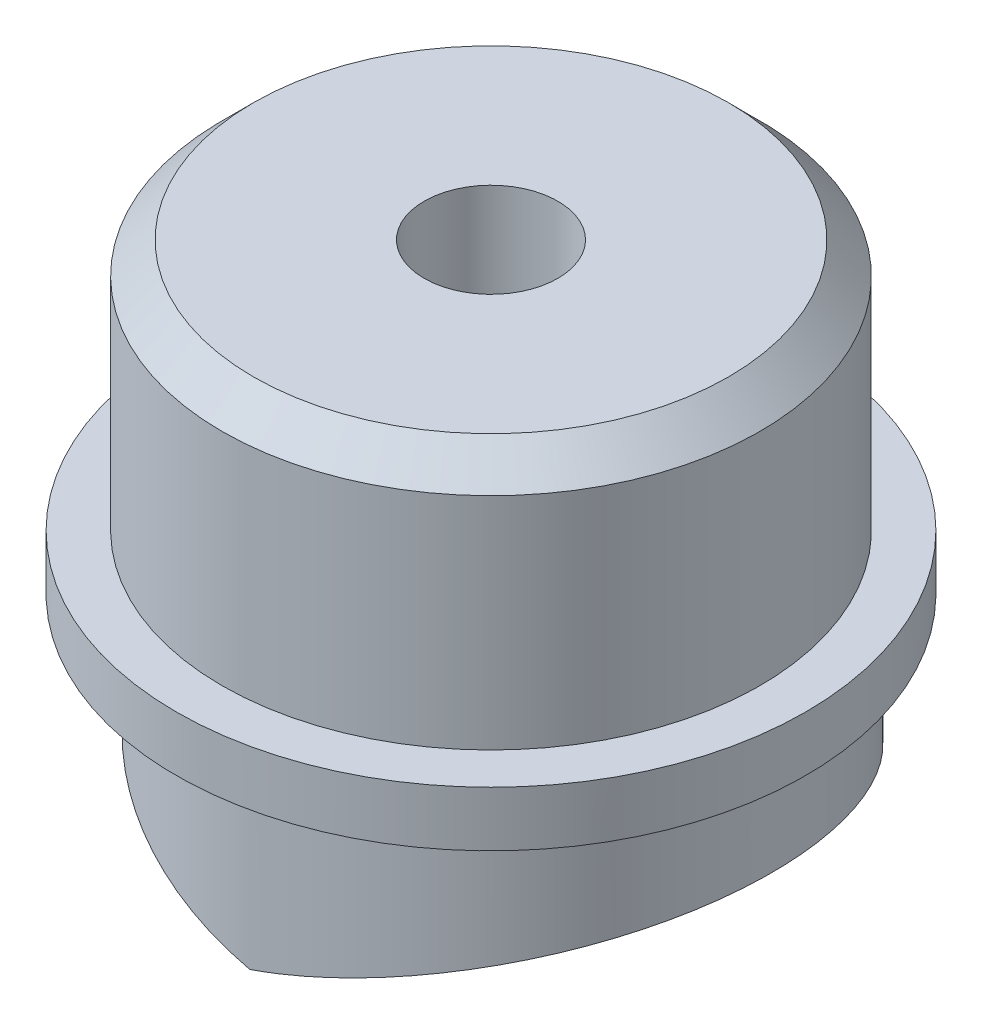
ISO-10303-21;
HEADER;
FILE_DESCRIPTION(('STEP AP214'),'2;1');
FILE_NAME('part.step','',(''),(''),'','','');
FILE_SCHEMA(('AUTOMOTIVE_DESIGN { 1 0 10303 214 1 1 1 1 }'));
ENDSEC;
DATA;
#1=APPLICATION_CONTEXT('core data for automotive mechanical design processes');
#2=APPLICATION_PROTOCOL_DEFINITION('international standard','automotive_design',2000,#1);
#3=PRODUCT_CONTEXT('',#1,'mechanical');
#4=PRODUCT('Part','Part','',(#3));
#5=PRODUCT_RELATED_PRODUCT_CATEGORY('part','',(#4));
#6=PRODUCT_DEFINITION_FORMATION('','',#4);
#7=PRODUCT_DEFINITION_CONTEXT('part definition',#1,'design');
#8=PRODUCT_DEFINITION('design','',#6,#7);
#9=PRODUCT_DEFINITION_SHAPE('','',#8);
#10=(LENGTH_UNIT() NAMED_UNIT(*) SI_UNIT(.MILLI.,.METRE.));
#11=(NAMED_UNIT(*) PLANE_ANGLE_UNIT() SI_UNIT($,.RADIAN.));
#12=(NAMED_UNIT(*) SI_UNIT($,.STERADIAN.) SOLID_ANGLE_UNIT());
#13=UNCERTAINTY_MEASURE_WITH_UNIT(LENGTH_MEASURE(1.E-05),#10,'distance_accuracy_value','');
#14=(GEOMETRIC_REPRESENTATION_CONTEXT(3) GLOBAL_UNCERTAINTY_ASSIGNED_CONTEXT((#13)) GLOBAL_UNIT_ASSIGNED_CONTEXT((#10,
#11,#12)) REPRESENTATION_CONTEXT('',''));
#15=CARTESIAN_POINT('',(0.,0.,0.));
#16=DIRECTION('',(0.,0.,1.));
#17=DIRECTION('',(1.,0.,0.));
#18=AXIS2_PLACEMENT_3D('',#15,#16,#17);
#19=CARTESIAN_POINT('',(-10.,25.4999999999969,-14.01));
#20=DIRECTION('',(-0.287347885566345,-0.957826285221151,0.));
#21=DIRECTION('',(0.957826285221151,-0.287347885566345,0.));
#22=AXIS2_PLACEMENT_3D('',#19,#20,#21);
#23=PLANE('',#22);
#24=DIRECTION('',(0.,0.,1.));
#25=VECTOR('',#24,1.);
#26=CARTESIAN_POINT('',(0.,22.4999999999969,-14.01));
#27=LINE('',#26,#25);
#28=CARTESIAN_POINT('',(0.,22.4999999999969,7.09999999999999));
#29=VERTEX_POINT('',#28);
#30=CARTESIAN_POINT('',(0.,22.4999999999969,7.66934219228311));
#31=VERTEX_POINT('',#30);
#32=EDGE_CURVE('E11',#29,#31,#27,.T.);
#33=ORIENTED_EDGE('',*,*,#32,.T.);
#34=CARTESIAN_POINT('',(-0.500000000000004,22.6499999999969,-0.866025403784436));
#35=DIRECTION('',(-0.287347885566345,-0.957826285221151,0.));
#36=DIRECTION('',(0.957826285221151,-0.287347885566345,0.));
#37=AXIS2_PLACEMENT_3D('',#34,#35,#36);
#38=ELLIPSE('',#37,8.92646206511852,8.55);
#39=CARTESIAN_POINT('',(0.,22.4999999999969,-9.40139299985199));
#40=VERTEX_POINT('',#39);
#41=EDGE_CURVE('E87',#31,#40,#38,.T.);
#42=ORIENTED_EDGE('',*,*,#41,.T.);
#43=CARTESIAN_POINT('',(0.,22.4999999999969,-2.125));
#44=VERTEX_POINT('',#43);
#45=EDGE_CURVE('E54',#40,#44,#27,.T.);
#46=ORIENTED_EDGE('',*,*,#45,.T.);
#47=CARTESIAN_POINT('',(0.,22.4999999999969,0.));
#48=DIRECTION('',(-0.287347885566345,-0.957826285221151,0.));
#49=DIRECTION('',(0.957826285221151,-0.287347885566345,0.));
#50=AXIS2_PLACEMENT_3D('',#47,#48,#49);
#51=ELLIPSE('',#50,2.21856513314349,2.125);
#52=CARTESIAN_POINT('',(0.,22.4999999999969,2.125));
#53=VERTEX_POINT('',#52);
#54=EDGE_CURVE('E47',#44,#53,#51,.F.);
#55=ORIENTED_EDGE('',*,*,#54,.T.);
#56=CARTESIAN_POINT('',(0.,22.4999999999969,2.89999999999999));
#57=VERTEX_POINT('',#56);
#58=EDGE_CURVE('E52',#53,#57,#27,.T.);
#59=ORIENTED_EDGE('',*,*,#58,.T.);
#60=CARTESIAN_POINT('',(0.,22.4999999999969,5.));
#61=DIRECTION('',(-0.287347885566345,-0.957826285221151,0.));
#62=DIRECTION('',(0.957826285221151,-0.287347885566345,0.));
#63=AXIS2_PLACEMENT_3D('',#60,#61,#62);
#64=ELLIPSE('',#63,2.19246436687122,2.1);
#65=EDGE_CURVE('E158',#29,#57,#64,.T.);
#66=ORIENTED_EDGE('',*,*,#65,.F.);
#67=EDGE_LOOP('',(#33,#42,#46,#55,#59,#66));
#68=FACE_BOUND('',#67,.T.);
#69=CARTESIAN_POINT('',(-4.33012701892218,23.7990381056736,-2.50000000000002));
#70=DIRECTION('',(-0.287347885566345,-0.957826285221151,0.));
#71=DIRECTION('',(0.957826285221151,-0.287347885566345,0.));
#72=AXIS2_PLACEMENT_3D('',#69,#70,#71);
#73=ELLIPSE('',#72,2.19246436687122,2.1);
#74=CARTESIAN_POINT('',(-2.23012701892218,23.1690381056736,-2.50000000000002));
#75=VERTEX_POINT('',#74);
#76=EDGE_CURVE('E95',#75,#75,#73,.T.);
#77=ORIENTED_EDGE('',*,*,#76,.F.);
#78=EDGE_LOOP('',(#77));
#79=FACE_BOUND('',#78,.T.);
#80=ADVANCED_FACE('F43',(#68,#79),#23,.T.);
#81=CARTESIAN_POINT('',(10.,25.4999999999969,-14.01));
#82=DIRECTION('',(0.287347885566345,-0.957826285221151,0.));
#83=DIRECTION('',(0.957826285221151,0.287347885566345,0.));
#84=AXIS2_PLACEMENT_3D('',#81,#82,#83);
#85=PLANE('',#84);
#86=ORIENTED_EDGE('',*,*,#45,.F.);
#87=CARTESIAN_POINT('',(-0.500000000000004,22.3499999999969,-0.866025403784436));
#88=DIRECTION('',(0.287347885566345,-0.957826285221151,0.));
#89=DIRECTION('',(-0.957826285221151,-0.287347885566345,0.));
#90=AXIS2_PLACEMENT_3D('',#87,#88,#89);
#91=ELLIPSE('',#90,8.92646206511852,8.55);
#92=EDGE_CURVE('E81',#40,#31,#91,.T.);
#93=ORIENTED_EDGE('',*,*,#92,.T.);
#94=ORIENTED_EDGE('',*,*,#32,.F.);
#95=CARTESIAN_POINT('',(0.,22.4999999999969,5.));
#96=DIRECTION('',(0.287347885566345,-0.957826285221151,0.));
#97=DIRECTION('',(-0.957826285221151,-0.287347885566345,0.));
#98=AXIS2_PLACEMENT_3D('',#95,#96,#97);
#99=ELLIPSE('',#98,2.19246436687122,2.1);
#100=EDGE_CURVE('E161',#57,#29,#99,.T.);
#101=ORIENTED_EDGE('',*,*,#100,.F.);
#102=ORIENTED_EDGE('',*,*,#58,.F.);
#103=CARTESIAN_POINT('',(0.,22.4999999999969,0.));
#104=DIRECTION('',(0.287347885566345,-0.957826285221151,0.));
#105=DIRECTION('',(-0.957826285221151,-0.287347885566345,0.));
#106=AXIS2_PLACEMENT_3D('',#103,#104,#105);
#107=ELLIPSE('',#106,2.21856513314349,2.125);
#108=EDGE_CURVE('E83',#53,#44,#107,.F.);
#109=ORIENTED_EDGE('',*,*,#108,.T.);
#110=EDGE_LOOP('',(#86,#93,#94,#101,#102,#109));
#111=FACE_BOUND('',#110,.T.);
#112=CARTESIAN_POINT('',(4.33012701892218,23.7990381056736,-2.50000000000002));
#113=DIRECTION('',(0.287347885566345,-0.957826285221151,0.));
#114=DIRECTION('',(-0.957826285221151,-0.287347885566345,0.));
#115=AXIS2_PLACEMENT_3D('',#112,#113,#114);
#116=ELLIPSE('',#115,2.19246436687122,2.1);
#117=CARTESIAN_POINT('',(2.23012701892218,23.1690381056736,-2.50000000000002));
#118=VERTEX_POINT('',#117);
#119=EDGE_CURVE('E92',#118,#118,#116,.T.);
#120=ORIENTED_EDGE('',*,*,#119,.F.);
#121=EDGE_LOOP('',(#120));
#122=FACE_BOUND('',#121,.T.);
#123=ADVANCED_FACE('F78',(#111,#122),#85,.T.);
#124=CARTESIAN_POINT('',(0.,31.5,5.));
#125=DIRECTION('',(0.,-1.,0.));
#126=DIRECTION('',(0.,0.,-1.));
#127=AXIS2_PLACEMENT_3D('',#124,#125,#126);
#128=CYLINDRICAL_SURFACE('',#127,2.1);
#129=CARTESIAN_POINT('',(0.,31.5,5.));
#130=DIRECTION('',(0.,1.,0.));
#131=DIRECTION('',(0.,0.,1.));
#132=AXIS2_PLACEMENT_3D('',#129,#130,#131);
#133=CIRCLE('',#132,2.1);
#134=CARTESIAN_POINT('',(0.,31.5,7.1));
#135=VERTEX_POINT('',#134);
#136=EDGE_CURVE('E85',#135,#135,#133,.T.);
#137=ORIENTED_EDGE('',*,*,#136,.T.);
#138=EDGE_LOOP('',(#137));
#139=FACE_BOUND('',#138,.T.);
#140=ORIENTED_EDGE('',*,*,#65,.T.);
#141=ORIENTED_EDGE('',*,*,#100,.T.);
#142=EDGE_LOOP('',(#140,#141));
#143=FACE_BOUND('',#142,.T.);
#144=ADVANCED_FACE('F110',(#139,#143),#128,.F.);
#145=CARTESIAN_POINT('',(0.,31.5,5.));
#146=DIRECTION('',(0.,1.,0.));
#147=DIRECTION('',(0.,0.,1.));
#148=AXIS2_PLACEMENT_3D('',#145,#146,#147);
#149=PLANE('',#148);
#150=ORIENTED_EDGE('',*,*,#136,.F.);
#151=EDGE_LOOP('',(#150));
#152=FACE_BOUND('',#151,.T.);
#153=ADVANCED_FACE('F125',(#152),#149,.F.);
#154=CARTESIAN_POINT('',(-4.33012701892218,31.5,-2.50000000000002));
#155=DIRECTION('',(0.,-1.,0.));
#156=DIRECTION('',(0.,0.,-1.));
#157=AXIS2_PLACEMENT_3D('',#154,#155,#156);
#158=CYLINDRICAL_SURFACE('',#157,2.1);
#159=CARTESIAN_POINT('',(-4.33012701892218,31.5,-2.50000000000002));
#160=DIRECTION('',(0.,1.,0.));
#161=DIRECTION('',(0.,0.,1.));
#162=AXIS2_PLACEMENT_3D('',#159,#160,#161);
#163=CIRCLE('',#162,2.1);
#164=CARTESIAN_POINT('',(-4.33012701892218,31.5,-0.400000000000019));
#165=VERTEX_POINT('',#164);
#166=EDGE_CURVE('E148',#165,#165,#163,.T.);
#167=ORIENTED_EDGE('',*,*,#166,.T.);
#168=EDGE_LOOP('',(#167));
#169=FACE_BOUND('',#168,.T.);
#170=ORIENTED_EDGE('',*,*,#76,.T.);
#171=EDGE_LOOP('',(#170));
#172=FACE_BOUND('',#171,.T.);
#173=ADVANCED_FACE('F127',(#169,#172),#158,.F.);
#174=CARTESIAN_POINT('',(-4.33012701892218,31.5,-2.50000000000002));
#175=DIRECTION('',(0.,1.,0.));
#176=DIRECTION('',(0.,0.,1.));
#177=AXIS2_PLACEMENT_3D('',#174,#175,#176);
#178=PLANE('',#177);
#179=ORIENTED_EDGE('',*,*,#166,.F.);
#180=EDGE_LOOP('',(#179));
#181=FACE_BOUND('',#180,.T.);
#182=ADVANCED_FACE('F129',(#181),#178,.F.);
#183=CARTESIAN_POINT('',(4.33012701892218,31.5,-2.50000000000002));
#184=DIRECTION('',(0.,-1.,0.));
#185=DIRECTION('',(0.,0.,-1.));
#186=AXIS2_PLACEMENT_3D('',#183,#184,#185);
#187=CYLINDRICAL_SURFACE('',#186,2.1);
#188=CARTESIAN_POINT('',(4.33012701892218,31.5,-2.50000000000002));
#189=DIRECTION('',(0.,1.,0.));
#190=DIRECTION('',(0.,0.,1.));
#191=AXIS2_PLACEMENT_3D('',#188,#189,#190);
#192=CIRCLE('',#191,2.1);
#193=CARTESIAN_POINT('',(4.33012701892218,31.5,-0.400000000000021));
#194=VERTEX_POINT('',#193);
#195=EDGE_CURVE('E146',#194,#194,#192,.T.);
#196=ORIENTED_EDGE('',*,*,#195,.T.);
#197=EDGE_LOOP('',(#196));
#198=FACE_BOUND('',#197,.T.);
#199=ORIENTED_EDGE('',*,*,#119,.T.);
#200=EDGE_LOOP('',(#199));
#201=FACE_BOUND('',#200,.T.);
#202=ADVANCED_FACE('F131',(#198,#201),#187,.F.);
#203=CARTESIAN_POINT('',(4.33012701892218,31.5,-2.50000000000002));
#204=DIRECTION('',(0.,1.,0.));
#205=DIRECTION('',(0.,0.,1.));
#206=AXIS2_PLACEMENT_3D('',#203,#204,#205);
#207=PLANE('',#206);
#208=ORIENTED_EDGE('',*,*,#195,.F.);
#209=EDGE_LOOP('',(#208));
#210=FACE_BOUND('',#209,.T.);
#211=ADVANCED_FACE('F133',(#210),#207,.F.);
#212=CARTESIAN_POINT('',(-0.500000000000004,30.75,-0.866025403784436));
#213=DIRECTION('',(0.,1.,0.));
#214=DIRECTION('',(0.,0.,1.));
#215=AXIS2_PLACEMENT_3D('',#212,#213,#214);
#216=PLANE('',#215);
#217=CARTESIAN_POINT('',(0.,30.75,0.));
#218=DIRECTION('',(0.,1.,0.));
#219=DIRECTION('',(0.,0.,1.));
#220=AXIS2_PLACEMENT_3D('',#217,#218,#219);
#221=CIRCLE('',#220,8.55);
#222=CARTESIAN_POINT('',(0.,30.75,8.55));
#223=VERTEX_POINT('',#222);
#224=EDGE_CURVE('E173',#223,#223,#221,.F.);
#225=ORIENTED_EDGE('',*,*,#224,.T.);
#226=EDGE_LOOP('',(#225));
#227=FACE_BOUND('',#226,.T.);
#228=CARTESIAN_POINT('',(0.,30.75,0.));
#229=DIRECTION('',(0.,1.,0.));
#230=DIRECTION('',(0.,0.,1.));
#231=AXIS2_PLACEMENT_3D('',#228,#229,#230);
#232=CIRCLE('',#231,10.);
#233=CARTESIAN_POINT('',(0.,30.75,10.));
#234=VERTEX_POINT('',#233);
#235=EDGE_CURVE('E154',#234,#234,#232,.F.);
#236=ORIENTED_EDGE('',*,*,#235,.F.);
#237=EDGE_LOOP('',(#236));
#238=FACE_BOUND('',#237,.T.);
#239=ADVANCED_FACE('F139',(#227,#238),#216,.T.);
#240=CARTESIAN_POINT('',(0.,59.0342712474619,0.));
#241=DIRECTION('',(0.,-1.,0.));
#242=DIRECTION('',(0.,0.,-1.));
#243=AXIS2_PLACEMENT_3D('',#240,#241,#242);
#244=CYLINDRICAL_SURFACE('',#243,10.);
#245=CARTESIAN_POINT('',(0.,29.,0.));
#246=DIRECTION('',(0.,-1.,0.));
#247=DIRECTION('',(0.,0.,-1.));
#248=AXIS2_PLACEMENT_3D('',#245,#246,#247);
#249=CIRCLE('',#248,10.);
#250=CARTESIAN_POINT('',(0.,29.,-10.));
#251=VERTEX_POINT('',#250);
#252=EDGE_CURVE('E149',#251,#251,#249,.T.);
#253=ORIENTED_EDGE('',*,*,#252,.F.);
#254=EDGE_LOOP('',(#253));
#255=FACE_BOUND('',#254,.T.);
#256=ORIENTED_EDGE('',*,*,#235,.T.);
#257=EDGE_LOOP('',(#256));
#258=FACE_BOUND('',#257,.T.);
#259=ADVANCED_FACE('F192',(#255,#258),#244,.T.);
#260=CARTESIAN_POINT('',(0.,29.,0.));
#261=DIRECTION('',(0.,1.,0.));
#262=DIRECTION('',(0.,0.,1.));
#263=AXIS2_PLACEMENT_3D('',#260,#261,#262);
#264=PLANE('',#263);
#265=CARTESIAN_POINT('',(-0.500000000000004,29.,-0.866025403784436));
#266=DIRECTION('',(0.,1.,0.));
#267=DIRECTION('',(0.,0.,1.));
#268=AXIS2_PLACEMENT_3D('',#265,#266,#267);
#269=CIRCLE('',#268,8.55);
#270=CARTESIAN_POINT('',(-0.500000000000004,29.,7.68397459621556));
#271=VERTEX_POINT('',#270);
#272=EDGE_CURVE('E178',#271,#271,#269,.T.);
#273=ORIENTED_EDGE('',*,*,#272,.T.);
#274=EDGE_LOOP('',(#273));
#275=FACE_BOUND('',#274,.T.);
#276=ORIENTED_EDGE('',*,*,#252,.T.);
#277=EDGE_LOOP('',(#276));
#278=FACE_BOUND('',#277,.T.);
#279=ADVANCED_FACE('F121',(#275,#278),#264,.F.);
#280=CARTESIAN_POINT('',(-0.500000000000004,30.75,-0.866025403784436));
#281=DIRECTION('',(0.,-1.,0.));
#282=DIRECTION('',(0.,0.,-1.));
#283=AXIS2_PLACEMENT_3D('',#280,#281,#282);
#284=CYLINDRICAL_SURFACE('',#283,8.55);
#285=ORIENTED_EDGE('',*,*,#272,.F.);
#286=EDGE_LOOP('',(#285));
#287=FACE_BOUND('',#286,.T.);
#288=ORIENTED_EDGE('',*,*,#92,.F.);
#289=ORIENTED_EDGE('',*,*,#41,.F.);
#290=EDGE_LOOP('',(#288,#289));
#291=FACE_BOUND('',#290,.T.);
#292=ADVANCED_FACE('F91',(#287,#291),#284,.T.);
#293=CARTESIAN_POINT('',(0.,38.75,0.));
#294=DIRECTION('',(0.,-1.,0.));
#295=DIRECTION('',(0.,0.,-1.));
#296=AXIS2_PLACEMENT_3D('',#293,#294,#295);
#297=CYLINDRICAL_SURFACE('',#296,8.55);
#298=CARTESIAN_POINT('',(0.,37.75,0.));
#299=DIRECTION('',(0.,1.,0.));
#300=DIRECTION('',(0.,0.,1.));
#301=AXIS2_PLACEMENT_3D('',#298,#299,#300);
#302=CIRCLE('',#301,8.55);
#303=CARTESIAN_POINT('',(0.,37.75,8.55));
#304=VERTEX_POINT('',#303);
#305=EDGE_CURVE('E160',#304,#304,#302,.F.);
#306=ORIENTED_EDGE('',*,*,#305,.T.);
#307=EDGE_LOOP('',(#306));
#308=FACE_BOUND('',#307,.T.);
#309=ORIENTED_EDGE('',*,*,#224,.F.);
#310=EDGE_LOOP('',(#309));
#311=FACE_BOUND('',#310,.T.);
#312=ADVANCED_FACE('F120',(#308,#311),#297,.T.);
#313=CARTESIAN_POINT('',(0.,38.75,0.));
#314=DIRECTION('',(0.,-1.,0.));
#315=DIRECTION('',(0.,0.,-1.));
#316=AXIS2_PLACEMENT_3D('',#313,#314,#315);
#317=CONICAL_SURFACE('',#316,7.54999999999999,0.785398163397444);
#318=ORIENTED_EDGE('',*,*,#305,.F.);
#319=EDGE_LOOP('',(#318));
#320=FACE_BOUND('',#319,.T.);
#321=CARTESIAN_POINT('',(0.,38.75,0.));
#322=DIRECTION('',(0.,1.,0.));
#323=DIRECTION('',(0.,0.,1.));
#324=AXIS2_PLACEMENT_3D('',#321,#322,#323);
#325=CIRCLE('',#324,7.54999999999999);
#326=CARTESIAN_POINT('',(0.,38.75,7.54999999999999));
#327=VERTEX_POINT('',#326);
#328=EDGE_CURVE('E168',#327,#327,#325,.T.);
#329=ORIENTED_EDGE('',*,*,#328,.F.);
#330=EDGE_LOOP('',(#329));
#331=FACE_BOUND('',#330,.T.);
#332=ADVANCED_FACE('F105',(#320,#331),#317,.T.);
#333=CARTESIAN_POINT('',(0.,38.75,0.));
#334=DIRECTION('',(0.,1.,0.));
#335=DIRECTION('',(0.,0.,1.));
#336=AXIS2_PLACEMENT_3D('',#333,#334,#335);
#337=PLANE('',#336);
#338=ORIENTED_EDGE('',*,*,#328,.T.);
#339=EDGE_LOOP('',(#338));
#340=FACE_BOUND('',#339,.T.);
#341=CARTESIAN_POINT('',(0.,38.75,0.));
#342=DIRECTION('',(0.,1.,0.));
#343=DIRECTION('',(0.,0.,1.));
#344=AXIS2_PLACEMENT_3D('',#341,#342,#343);
#345=CIRCLE('',#344,2.125);
#346=CARTESIAN_POINT('',(0.,38.75,2.125));
#347=VERTEX_POINT('',#346);
#348=EDGE_CURVE('E181',#347,#347,#345,.T.);
#349=ORIENTED_EDGE('',*,*,#348,.F.);
#350=EDGE_LOOP('',(#349));
#351=FACE_BOUND('',#350,.T.);
#352=ADVANCED_FACE('F100',(#340,#351),#337,.T.);
#353=CARTESIAN_POINT('',(0.,30.75,0.));
#354=DIRECTION('',(0.,-1.,0.));
#355=DIRECTION('',(0.,0.,-1.));
#356=AXIS2_PLACEMENT_3D('',#353,#354,#355);
#357=CYLINDRICAL_SURFACE('',#356,2.125);
#358=ORIENTED_EDGE('',*,*,#348,.T.);
#359=EDGE_LOOP('',(#358));
#360=FACE_BOUND('',#359,.T.);
#361=ORIENTED_EDGE('',*,*,#108,.F.);
#362=ORIENTED_EDGE('',*,*,#54,.F.);
#363=EDGE_LOOP('',(#361,#362));
#364=FACE_BOUND('',#363,.T.);
#365=ADVANCED_FACE('F45',(#360,#364),#357,.F.);
#366=CLOSED_SHELL('',(#80,#123,#144,#153,#173,#182,#202,#211,#239,#259,#279,#292,#312,#332,#352,#365));
#367=MANIFOLD_SOLID_BREP('B2',#366);
#368=ADVANCED_BREP_SHAPE_REPRESENTATION('',(#18,#367),#14);
#369=SHAPE_DEFINITION_REPRESENTATION(#9,#368);
ENDSEC;
END-ISO-10303-21;
